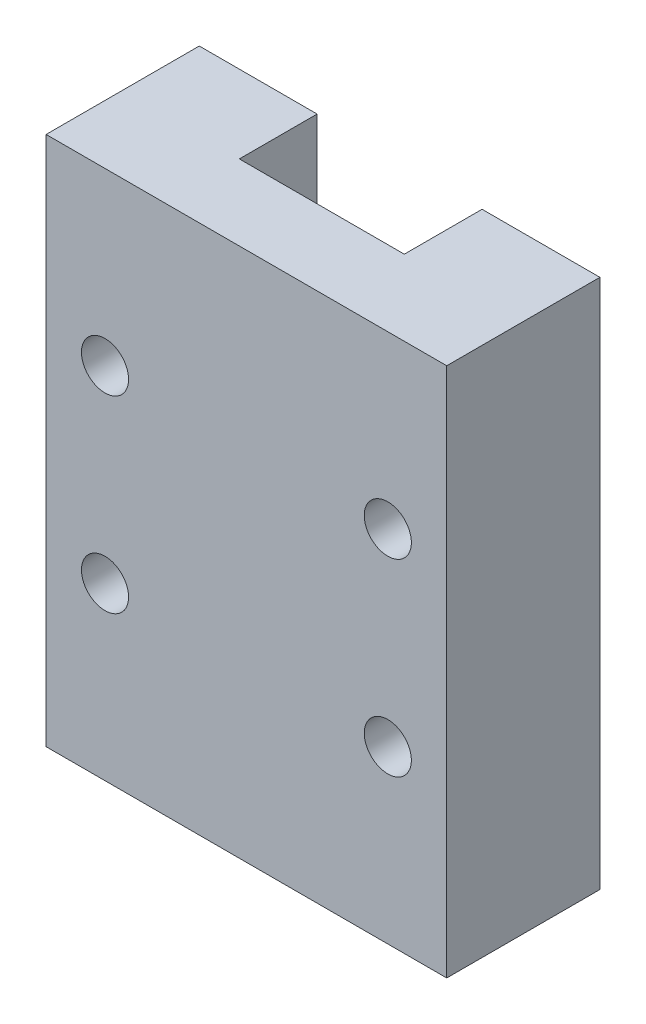
ISO-10303-21;
HEADER;
FILE_DESCRIPTION(('STEP AP214'),'2;1');
FILE_NAME('part.step','',(''),(''),'','','');
FILE_SCHEMA(('AUTOMOTIVE_DESIGN { 1 0 10303 214 1 1 1 1 }'));
ENDSEC;
DATA;
#1=APPLICATION_CONTEXT('core data for automotive mechanical design processes');
#2=APPLICATION_PROTOCOL_DEFINITION('international standard','automotive_design',2000,#1);
#3=PRODUCT_CONTEXT('',#1,'mechanical');
#4=PRODUCT('Part','Part','',(#3));
#5=PRODUCT_RELATED_PRODUCT_CATEGORY('part','',(#4));
#6=PRODUCT_DEFINITION_FORMATION('','',#4);
#7=PRODUCT_DEFINITION_CONTEXT('part definition',#1,'design');
#8=PRODUCT_DEFINITION('design','',#6,#7);
#9=PRODUCT_DEFINITION_SHAPE('','',#8);
#10=(LENGTH_UNIT() NAMED_UNIT(*) SI_UNIT(.MILLI.,.METRE.));
#11=(NAMED_UNIT(*) PLANE_ANGLE_UNIT() SI_UNIT($,.RADIAN.));
#12=(NAMED_UNIT(*) SI_UNIT($,.STERADIAN.) SOLID_ANGLE_UNIT());
#13=UNCERTAINTY_MEASURE_WITH_UNIT(LENGTH_MEASURE(1.E-05),#10,'distance_accuracy_value','');
#14=(GEOMETRIC_REPRESENTATION_CONTEXT(3) GLOBAL_UNCERTAINTY_ASSIGNED_CONTEXT((#13)) GLOBAL_UNIT_ASSIGNED_CONTEXT((#10,
#11,#12)) REPRESENTATION_CONTEXT('',''));
#15=CARTESIAN_POINT('',(0.,0.,0.));
#16=DIRECTION('',(0.,0.,1.));
#17=DIRECTION('',(1.,0.,0.));
#18=AXIS2_PLACEMENT_3D('',#15,#16,#17);
#19=CARTESIAN_POINT('',(0.,0.,-6.5));
#20=DIRECTION('',(0.,0.,-1.));
#21=DIRECTION('',(-1.,0.,0.));
#22=AXIS2_PLACEMENT_3D('',#19,#20,#21);
#23=PLANE('',#22);
#24=DIRECTION('',(0.,-1.,0.));
#25=VECTOR('',#24,1.);
#26=CARTESIAN_POINT('',(3.5,0.,-6.5));
#27=LINE('',#26,#25);
#28=CARTESIAN_POINT('',(3.5,11.25,-6.5));
#29=VERTEX_POINT('',#28);
#30=CARTESIAN_POINT('',(3.5,-11.25,-6.5));
#31=VERTEX_POINT('',#30);
#32=EDGE_CURVE('E11',#29,#31,#27,.T.);
#33=ORIENTED_EDGE('',*,*,#32,.F.);
#34=DIRECTION('',(-1.,0.,0.));
#35=VECTOR('',#34,1.);
#36=CARTESIAN_POINT('',(-8.5,11.25,-6.5));
#37=LINE('',#36,#35);
#38=CARTESIAN_POINT('',(8.5,11.25,-6.5));
#39=VERTEX_POINT('',#38);
#40=EDGE_CURVE('E126',#39,#29,#37,.T.);
#41=ORIENTED_EDGE('',*,*,#40,.F.);
#42=DIRECTION('',(0.,1.,0.));
#43=VECTOR('',#42,1.);
#44=CARTESIAN_POINT('',(8.5,-11.25,-6.5));
#45=LINE('',#44,#43);
#46=CARTESIAN_POINT('',(8.5,-11.25,-6.5));
#47=VERTEX_POINT('',#46);
#48=EDGE_CURVE('E160',#47,#39,#45,.T.);
#49=ORIENTED_EDGE('',*,*,#48,.F.);
#50=DIRECTION('',(1.,0.,0.));
#51=VECTOR('',#50,1.);
#52=CARTESIAN_POINT('',(-8.5,-11.25,-6.5));
#53=LINE('',#52,#51);
#54=EDGE_CURVE('E58',#31,#47,#53,.T.);
#55=ORIENTED_EDGE('',*,*,#54,.F.);
#56=EDGE_LOOP('',(#33,#41,#49,#55));
#57=FACE_BOUND('',#56,.T.);
#58=ADVANCED_FACE('F34',(#57),#23,.T.);
#59=CARTESIAN_POINT('',(8.5,-11.25,-6.5));
#60=DIRECTION('',(1.,0.,0.));
#61=DIRECTION('',(0.,0.,-1.));
#62=AXIS2_PLACEMENT_3D('',#59,#60,#61);
#63=PLANE('',#62);
#64=DIRECTION('',(0.,1.,0.));
#65=VECTOR('',#64,1.);
#66=CARTESIAN_POINT('',(8.5,-11.25,0.));
#67=LINE('',#66,#65);
#68=CARTESIAN_POINT('',(8.5,-11.25,0.));
#69=VERTEX_POINT('',#68);
#70=CARTESIAN_POINT('',(8.5,11.25,0.));
#71=VERTEX_POINT('',#70);
#72=EDGE_CURVE('E157',#69,#71,#67,.T.);
#73=ORIENTED_EDGE('',*,*,#72,.F.);
#74=DIRECTION('',(0.,0.,1.));
#75=VECTOR('',#74,1.);
#76=CARTESIAN_POINT('',(8.5,-11.25,-6.5));
#77=LINE('',#76,#75);
#78=EDGE_CURVE('E77',#47,#69,#77,.T.);
#79=ORIENTED_EDGE('',*,*,#78,.F.);
#80=ORIENTED_EDGE('',*,*,#48,.T.);
#81=DIRECTION('',(0.,0.,1.));
#82=VECTOR('',#81,1.);
#83=CARTESIAN_POINT('',(8.5,11.25,-6.5));
#84=LINE('',#83,#82);
#85=EDGE_CURVE('E84',#39,#71,#84,.T.);
#86=ORIENTED_EDGE('',*,*,#85,.T.);
#87=EDGE_LOOP('',(#73,#79,#80,#86));
#88=FACE_BOUND('',#87,.T.);
#89=ADVANCED_FACE('F36',(#88),#63,.T.);
#90=CARTESIAN_POINT('',(-8.5,-11.25,-6.5));
#91=DIRECTION('',(0.,-1.,0.));
#92=DIRECTION('',(0.,0.,-1.));
#93=AXIS2_PLACEMENT_3D('',#90,#91,#92);
#94=PLANE('',#93);
#95=DIRECTION('',(0.,0.,1.));
#96=VECTOR('',#95,1.);
#97=CARTESIAN_POINT('',(3.5,-11.25,-9.8));
#98=LINE('',#97,#96);
#99=CARTESIAN_POINT('',(3.5,-11.25,-3.2));
#100=VERTEX_POINT('',#99);
#101=EDGE_CURVE('E112',#31,#100,#98,.T.);
#102=ORIENTED_EDGE('',*,*,#101,.F.);
#103=ORIENTED_EDGE('',*,*,#54,.T.);
#104=ORIENTED_EDGE('',*,*,#78,.T.);
#105=DIRECTION('',(1.,0.,0.));
#106=VECTOR('',#105,1.);
#107=CARTESIAN_POINT('',(-8.5,-11.25,0.));
#108=LINE('',#107,#106);
#109=CARTESIAN_POINT('',(-8.5,-11.25,0.));
#110=VERTEX_POINT('',#109);
#111=EDGE_CURVE('E164',#110,#69,#108,.T.);
#112=ORIENTED_EDGE('',*,*,#111,.F.);
#113=DIRECTION('',(0.,0.,1.));
#114=VECTOR('',#113,1.);
#115=CARTESIAN_POINT('',(-8.5,-11.25,-6.5));
#116=LINE('',#115,#114);
#117=CARTESIAN_POINT('',(-8.5,-11.25,-6.5));
#118=VERTEX_POINT('',#117);
#119=EDGE_CURVE('E183',#118,#110,#116,.T.);
#120=ORIENTED_EDGE('',*,*,#119,.F.);
#121=CARTESIAN_POINT('',(-3.5,-11.25,-6.5));
#122=VERTEX_POINT('',#121);
#123=EDGE_CURVE('E169',#118,#122,#53,.T.);
#124=ORIENTED_EDGE('',*,*,#123,.T.);
#125=DIRECTION('',(0.,0.,-1.));
#126=VECTOR('',#125,1.);
#127=CARTESIAN_POINT('',(-3.5,-11.25,-9.8));
#128=LINE('',#127,#126);
#129=CARTESIAN_POINT('',(-3.5,-11.25,-3.2));
#130=VERTEX_POINT('',#129);
#131=EDGE_CURVE('E49',#130,#122,#128,.T.);
#132=ORIENTED_EDGE('',*,*,#131,.F.);
#133=DIRECTION('',(-1.,0.,0.));
#134=VECTOR('',#133,1.);
#135=CARTESIAN_POINT('',(-3.5,-11.25,-3.2));
#136=LINE('',#135,#134);
#137=EDGE_CURVE('E128',#100,#130,#136,.T.);
#138=ORIENTED_EDGE('',*,*,#137,.F.);
#139=EDGE_LOOP('',(#102,#103,#104,#112,#120,#124,#132,#138));
#140=FACE_BOUND('',#139,.T.);
#141=ADVANCED_FACE('F202',(#140),#94,.T.);
#142=CARTESIAN_POINT('',(-8.5,-11.25,-6.5));
#143=DIRECTION('',(-1.,0.,0.));
#144=DIRECTION('',(0.,0.,1.));
#145=AXIS2_PLACEMENT_3D('',#142,#143,#144);
#146=PLANE('',#145);
#147=DIRECTION('',(0.,-1.,0.));
#148=VECTOR('',#147,1.);
#149=CARTESIAN_POINT('',(-8.5,-11.25,0.));
#150=LINE('',#149,#148);
#151=CARTESIAN_POINT('',(-8.5,11.25,0.));
#152=VERTEX_POINT('',#151);
#153=EDGE_CURVE('E177',#152,#110,#150,.T.);
#154=ORIENTED_EDGE('',*,*,#153,.F.);
#155=DIRECTION('',(0.,0.,1.));
#156=VECTOR('',#155,1.);
#157=CARTESIAN_POINT('',(-8.5,11.25,-6.5));
#158=LINE('',#157,#156);
#159=CARTESIAN_POINT('',(-8.5,11.25,-6.5));
#160=VERTEX_POINT('',#159);
#161=EDGE_CURVE('E185',#160,#152,#158,.T.);
#162=ORIENTED_EDGE('',*,*,#161,.F.);
#163=DIRECTION('',(0.,-1.,0.));
#164=VECTOR('',#163,1.);
#165=CARTESIAN_POINT('',(-8.5,-11.25,-6.5));
#166=LINE('',#165,#164);
#167=EDGE_CURVE('E166',#160,#118,#166,.T.);
#168=ORIENTED_EDGE('',*,*,#167,.T.);
#169=ORIENTED_EDGE('',*,*,#119,.T.);
#170=EDGE_LOOP('',(#154,#162,#168,#169));
#171=FACE_BOUND('',#170,.T.);
#172=ADVANCED_FACE('F196',(#171),#146,.T.);
#173=CARTESIAN_POINT('',(-8.5,11.25,-6.5));
#174=DIRECTION('',(0.,1.,0.));
#175=DIRECTION('',(0.,0.,1.));
#176=AXIS2_PLACEMENT_3D('',#173,#174,#175);
#177=PLANE('',#176);
#178=DIRECTION('',(0.,0.,1.));
#179=VECTOR('',#178,1.);
#180=CARTESIAN_POINT('',(3.5,11.25,-9.8));
#181=LINE('',#180,#179);
#182=CARTESIAN_POINT('',(3.5,11.25,-3.2));
#183=VERTEX_POINT('',#182);
#184=EDGE_CURVE('E110',#29,#183,#181,.T.);
#185=ORIENTED_EDGE('',*,*,#184,.T.);
#186=DIRECTION('',(-1.,0.,0.));
#187=VECTOR('',#186,1.);
#188=CARTESIAN_POINT('',(-3.5,11.25,-3.2));
#189=LINE('',#188,#187);
#190=CARTESIAN_POINT('',(-3.5,11.25,-3.2));
#191=VERTEX_POINT('',#190);
#192=EDGE_CURVE('E120',#183,#191,#189,.T.);
#193=ORIENTED_EDGE('',*,*,#192,.T.);
#194=DIRECTION('',(0.,0.,-1.));
#195=VECTOR('',#194,1.);
#196=CARTESIAN_POINT('',(-3.5,11.25,-9.8));
#197=LINE('',#196,#195);
#198=CARTESIAN_POINT('',(-3.5,11.25,-6.5));
#199=VERTEX_POINT('',#198);
#200=EDGE_CURVE('E117',#191,#199,#197,.T.);
#201=ORIENTED_EDGE('',*,*,#200,.T.);
#202=EDGE_CURVE('E163',#199,#160,#37,.T.);
#203=ORIENTED_EDGE('',*,*,#202,.T.);
#204=ORIENTED_EDGE('',*,*,#161,.T.);
#205=DIRECTION('',(-1.,0.,0.));
#206=VECTOR('',#205,1.);
#207=CARTESIAN_POINT('',(-8.5,11.25,0.));
#208=LINE('',#207,#206);
#209=EDGE_CURVE('E174',#71,#152,#208,.T.);
#210=ORIENTED_EDGE('',*,*,#209,.F.);
#211=ORIENTED_EDGE('',*,*,#85,.F.);
#212=ORIENTED_EDGE('',*,*,#40,.T.);
#213=EDGE_LOOP('',(#185,#193,#201,#203,#204,#210,#211,#212));
#214=FACE_BOUND('',#213,.T.);
#215=ADVANCED_FACE('F125',(#214),#177,.T.);
#216=DIRECTION('',(0.,1.,0.));
#217=VECTOR('',#216,1.);
#218=CARTESIAN_POINT('',(-3.5,0.,-6.5));
#219=LINE('',#218,#217);
#220=EDGE_CURVE('E42',#122,#199,#219,.T.);
#221=ORIENTED_EDGE('',*,*,#220,.F.);
#222=ORIENTED_EDGE('',*,*,#123,.F.);
#223=ORIENTED_EDGE('',*,*,#167,.F.);
#224=ORIENTED_EDGE('',*,*,#202,.F.);
#225=EDGE_LOOP('',(#221,#222,#223,#224));
#226=FACE_BOUND('',#225,.T.);
#227=ADVANCED_FACE('F193',(#226),#23,.T.);
#228=CARTESIAN_POINT('',(0.,0.,0.));
#229=DIRECTION('',(0.,0.,-1.));
#230=DIRECTION('',(-1.,0.,0.));
#231=AXIS2_PLACEMENT_3D('',#228,#229,#230);
#232=PLANE('',#231);
#233=CARTESIAN_POINT('',(-6.,4.,0.));
#234=DIRECTION('',(0.,0.,1.));
#235=DIRECTION('',(1.,0.,0.));
#236=AXIS2_PLACEMENT_3D('',#233,#234,#235);
#237=CIRCLE('',#236,1.);
#238=CARTESIAN_POINT('',(-5.,4.,0.));
#239=VERTEX_POINT('',#238);
#240=EDGE_CURVE('E134',#239,#239,#237,.T.);
#241=ORIENTED_EDGE('',*,*,#240,.F.);
#242=EDGE_LOOP('',(#241));
#243=FACE_BOUND('',#242,.T.);
#244=CARTESIAN_POINT('',(-6.,-4.,0.));
#245=DIRECTION('',(0.,0.,1.));
#246=DIRECTION('',(1.,0.,0.));
#247=AXIS2_PLACEMENT_3D('',#244,#245,#246);
#248=CIRCLE('',#247,1.);
#249=CARTESIAN_POINT('',(-5.,-4.,0.));
#250=VERTEX_POINT('',#249);
#251=EDGE_CURVE('E146',#250,#250,#248,.T.);
#252=ORIENTED_EDGE('',*,*,#251,.F.);
#253=EDGE_LOOP('',(#252));
#254=FACE_BOUND('',#253,.T.);
#255=CARTESIAN_POINT('',(6.,-4.,0.));
#256=DIRECTION('',(0.,0.,1.));
#257=DIRECTION('',(1.,0.,0.));
#258=AXIS2_PLACEMENT_3D('',#255,#256,#257);
#259=CIRCLE('',#258,1.);
#260=CARTESIAN_POINT('',(7.,-4.,0.));
#261=VERTEX_POINT('',#260);
#262=EDGE_CURVE('E140',#261,#261,#259,.T.);
#263=ORIENTED_EDGE('',*,*,#262,.F.);
#264=EDGE_LOOP('',(#263));
#265=FACE_BOUND('',#264,.T.);
#266=CARTESIAN_POINT('',(6.,4.,0.));
#267=DIRECTION('',(0.,0.,1.));
#268=DIRECTION('',(1.,0.,0.));
#269=AXIS2_PLACEMENT_3D('',#266,#267,#268);
#270=CIRCLE('',#269,1.);
#271=CARTESIAN_POINT('',(7.,4.,0.));
#272=VERTEX_POINT('',#271);
#273=EDGE_CURVE('E139',#272,#272,#270,.T.);
#274=ORIENTED_EDGE('',*,*,#273,.F.);
#275=EDGE_LOOP('',(#274));
#276=FACE_BOUND('',#275,.T.);
#277=ORIENTED_EDGE('',*,*,#72,.T.);
#278=ORIENTED_EDGE('',*,*,#209,.T.);
#279=ORIENTED_EDGE('',*,*,#153,.T.);
#280=ORIENTED_EDGE('',*,*,#111,.T.);
#281=EDGE_LOOP('',(#277,#278,#279,#280));
#282=FACE_BOUND('',#281,.T.);
#283=ADVANCED_FACE('F198',(#243,#254,#265,#276,#282),#232,.F.);
#284=CARTESIAN_POINT('',(6.,4.,-2.5));
#285=DIRECTION('',(0.,0.,1.));
#286=DIRECTION('',(1.,0.,0.));
#287=AXIS2_PLACEMENT_3D('',#284,#285,#286);
#288=CYLINDRICAL_SURFACE('',#287,1.);
#289=CARTESIAN_POINT('',(6.,4.,-2.5));
#290=DIRECTION('',(0.,0.,1.));
#291=DIRECTION('',(1.,0.,0.));
#292=AXIS2_PLACEMENT_3D('',#289,#290,#291);
#293=CIRCLE('',#292,1.);
#294=CARTESIAN_POINT('',(7.,4.,-2.5));
#295=VERTEX_POINT('',#294);
#296=EDGE_CURVE('E154',#295,#295,#293,.T.);
#297=ORIENTED_EDGE('',*,*,#296,.F.);
#298=EDGE_LOOP('',(#297));
#299=FACE_BOUND('',#298,.T.);
#300=ORIENTED_EDGE('',*,*,#273,.T.);
#301=EDGE_LOOP('',(#300));
#302=FACE_BOUND('',#301,.T.);
#303=ADVANCED_FACE('F221',(#299,#302),#288,.F.);
#304=CARTESIAN_POINT('',(6.,4.,-2.5));
#305=DIRECTION('',(0.,0.,1.));
#306=DIRECTION('',(1.,0.,0.));
#307=AXIS2_PLACEMENT_3D('',#304,#305,#306);
#308=PLANE('',#307);
#309=ORIENTED_EDGE('',*,*,#296,.T.);
#310=EDGE_LOOP('',(#309));
#311=FACE_BOUND('',#310,.T.);
#312=ADVANCED_FACE('F249',(#311),#308,.T.);
#313=CARTESIAN_POINT('',(6.,-4.,-2.5));
#314=DIRECTION('',(0.,0.,1.));
#315=DIRECTION('',(1.,0.,0.));
#316=AXIS2_PLACEMENT_3D('',#313,#314,#315);
#317=CYLINDRICAL_SURFACE('',#316,1.);
#318=CARTESIAN_POINT('',(6.,-4.,-2.5));
#319=DIRECTION('',(0.,0.,1.));
#320=DIRECTION('',(1.,0.,0.));
#321=AXIS2_PLACEMENT_3D('',#318,#319,#320);
#322=CIRCLE('',#321,1.);
#323=CARTESIAN_POINT('',(7.,-4.,-2.5));
#324=VERTEX_POINT('',#323);
#325=EDGE_CURVE('E136',#324,#324,#322,.T.);
#326=ORIENTED_EDGE('',*,*,#325,.F.);
#327=EDGE_LOOP('',(#326));
#328=FACE_BOUND('',#327,.T.);
#329=ORIENTED_EDGE('',*,*,#262,.T.);
#330=EDGE_LOOP('',(#329));
#331=FACE_BOUND('',#330,.T.);
#332=ADVANCED_FACE('F258',(#328,#331),#317,.F.);
#333=CARTESIAN_POINT('',(6.,-4.,-2.5));
#334=DIRECTION('',(0.,0.,1.));
#335=DIRECTION('',(1.,0.,0.));
#336=AXIS2_PLACEMENT_3D('',#333,#334,#335);
#337=PLANE('',#336);
#338=ORIENTED_EDGE('',*,*,#325,.T.);
#339=EDGE_LOOP('',(#338));
#340=FACE_BOUND('',#339,.T.);
#341=ADVANCED_FACE('F268',(#340),#337,.T.);
#342=CARTESIAN_POINT('',(-6.,-4.,-2.5));
#343=DIRECTION('',(0.,0.,1.));
#344=DIRECTION('',(1.,0.,0.));
#345=AXIS2_PLACEMENT_3D('',#342,#343,#344);
#346=CYLINDRICAL_SURFACE('',#345,1.);
#347=CARTESIAN_POINT('',(-6.,-4.,-2.5));
#348=DIRECTION('',(0.,0.,1.));
#349=DIRECTION('',(1.,0.,0.));
#350=AXIS2_PLACEMENT_3D('',#347,#348,#349);
#351=CIRCLE('',#350,1.);
#352=CARTESIAN_POINT('',(-5.,-4.,-2.5));
#353=VERTEX_POINT('',#352);
#354=EDGE_CURVE('E143',#353,#353,#351,.T.);
#355=ORIENTED_EDGE('',*,*,#354,.F.);
#356=EDGE_LOOP('',(#355));
#357=FACE_BOUND('',#356,.T.);
#358=ORIENTED_EDGE('',*,*,#251,.T.);
#359=EDGE_LOOP('',(#358));
#360=FACE_BOUND('',#359,.T.);
#361=ADVANCED_FACE('F278',(#357,#360),#346,.F.);
#362=CARTESIAN_POINT('',(-6.,-4.,-2.5));
#363=DIRECTION('',(0.,0.,1.));
#364=DIRECTION('',(1.,0.,0.));
#365=AXIS2_PLACEMENT_3D('',#362,#363,#364);
#366=PLANE('',#365);
#367=ORIENTED_EDGE('',*,*,#354,.T.);
#368=EDGE_LOOP('',(#367));
#369=FACE_BOUND('',#368,.T.);
#370=ADVANCED_FACE('F288',(#369),#366,.T.);
#371=CARTESIAN_POINT('',(-6.,4.,-2.5));
#372=DIRECTION('',(0.,0.,1.));
#373=DIRECTION('',(1.,0.,0.));
#374=AXIS2_PLACEMENT_3D('',#371,#372,#373);
#375=CYLINDRICAL_SURFACE('',#374,1.);
#376=CARTESIAN_POINT('',(-6.,4.,-2.5));
#377=DIRECTION('',(0.,0.,1.));
#378=DIRECTION('',(1.,0.,0.));
#379=AXIS2_PLACEMENT_3D('',#376,#377,#378);
#380=CIRCLE('',#379,1.);
#381=CARTESIAN_POINT('',(-5.,4.,-2.5));
#382=VERTEX_POINT('',#381);
#383=EDGE_CURVE('E149',#382,#382,#380,.T.);
#384=ORIENTED_EDGE('',*,*,#383,.F.);
#385=EDGE_LOOP('',(#384));
#386=FACE_BOUND('',#385,.T.);
#387=ORIENTED_EDGE('',*,*,#240,.T.);
#388=EDGE_LOOP('',(#387));
#389=FACE_BOUND('',#388,.T.);
#390=ADVANCED_FACE('F298',(#386,#389),#375,.F.);
#391=CARTESIAN_POINT('',(-6.,4.,-2.5));
#392=DIRECTION('',(0.,0.,1.));
#393=DIRECTION('',(1.,0.,0.));
#394=AXIS2_PLACEMENT_3D('',#391,#392,#393);
#395=PLANE('',#394);
#396=ORIENTED_EDGE('',*,*,#383,.T.);
#397=EDGE_LOOP('',(#396));
#398=FACE_BOUND('',#397,.T.);
#399=ADVANCED_FACE('F308',(#398),#395,.T.);
#400=CARTESIAN_POINT('',(3.5,11.25,-9.8));
#401=DIRECTION('',(1.,0.,0.));
#402=DIRECTION('',(0.,0.,-1.));
#403=AXIS2_PLACEMENT_3D('',#400,#401,#402);
#404=PLANE('',#403);
#405=ORIENTED_EDGE('',*,*,#32,.T.);
#406=ORIENTED_EDGE('',*,*,#101,.T.);
#407=DIRECTION('',(0.,-1.,0.));
#408=VECTOR('',#407,1.);
#409=CARTESIAN_POINT('',(3.5,11.25,-3.2));
#410=LINE('',#409,#408);
#411=EDGE_CURVE('E106',#183,#100,#410,.T.);
#412=ORIENTED_EDGE('',*,*,#411,.F.);
#413=ORIENTED_EDGE('',*,*,#184,.F.);
#414=EDGE_LOOP('',(#405,#406,#412,#413));
#415=FACE_BOUND('',#414,.T.);
#416=ADVANCED_FACE('F108',(#415),#404,.F.);
#417=CARTESIAN_POINT('',(-3.5,11.25,-9.8));
#418=DIRECTION('',(-1.,0.,0.));
#419=DIRECTION('',(0.,0.,1.));
#420=AXIS2_PLACEMENT_3D('',#417,#418,#419);
#421=PLANE('',#420);
#422=ORIENTED_EDGE('',*,*,#220,.T.);
#423=ORIENTED_EDGE('',*,*,#200,.F.);
#424=DIRECTION('',(0.,-1.,0.));
#425=VECTOR('',#424,1.);
#426=CARTESIAN_POINT('',(-3.5,11.25,-3.2));
#427=LINE('',#426,#425);
#428=EDGE_CURVE('E116',#191,#130,#427,.T.);
#429=ORIENTED_EDGE('',*,*,#428,.T.);
#430=ORIENTED_EDGE('',*,*,#131,.T.);
#431=EDGE_LOOP('',(#422,#423,#429,#430));
#432=FACE_BOUND('',#431,.T.);
#433=ADVANCED_FACE('F187',(#432),#421,.F.);
#434=CARTESIAN_POINT('',(-3.5,11.25,-3.2));
#435=DIRECTION('',(0.,0.,1.));
#436=DIRECTION('',(1.,0.,0.));
#437=AXIS2_PLACEMENT_3D('',#434,#435,#436);
#438=PLANE('',#437);
#439=ORIENTED_EDGE('',*,*,#137,.T.);
#440=ORIENTED_EDGE('',*,*,#428,.F.);
#441=ORIENTED_EDGE('',*,*,#192,.F.);
#442=ORIENTED_EDGE('',*,*,#411,.T.);
#443=EDGE_LOOP('',(#439,#440,#441,#442));
#444=FACE_BOUND('',#443,.T.);
#445=ADVANCED_FACE('F121',(#444),#438,.F.);
#446=CLOSED_SHELL('',(#58,#89,#141,#172,#215,#227,#283,#303,#312,#332,#341,#361,#370,#390,#399,
#416,#433,#445));
#447=MANIFOLD_SOLID_BREP('B2',#446);
#448=ADVANCED_BREP_SHAPE_REPRESENTATION('',(#18,#447),#14);
#449=SHAPE_DEFINITION_REPRESENTATION(#9,#448);
ENDSEC;
END-ISO-10303-21;
